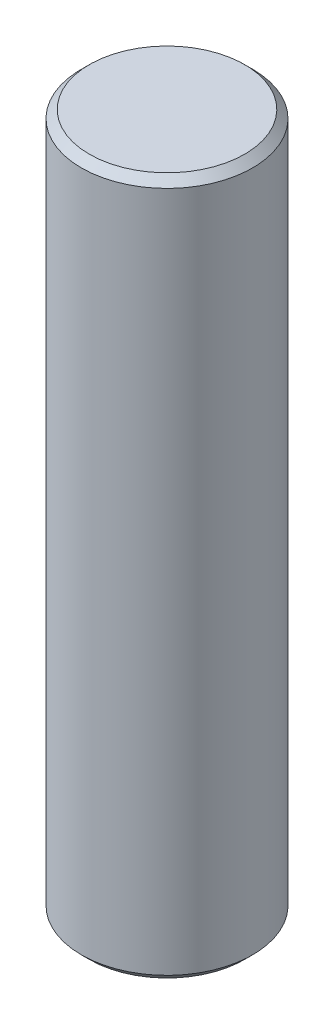
ISO-10303-21;
HEADER;
FILE_DESCRIPTION(('STEP AP214'),'2;1');
FILE_NAME('part.step','',(''),(''),'','','');
FILE_SCHEMA(('AUTOMOTIVE_DESIGN { 1 0 10303 214 1 1 1 1 }'));
ENDSEC;
DATA;
#1=APPLICATION_CONTEXT('core data for automotive mechanical design processes');
#2=APPLICATION_PROTOCOL_DEFINITION('international standard','automotive_design',2000,#1);
#3=PRODUCT_CONTEXT('',#1,'mechanical');
#4=PRODUCT('Part','Part','',(#3));
#5=PRODUCT_RELATED_PRODUCT_CATEGORY('part','',(#4));
#6=PRODUCT_DEFINITION_FORMATION('','',#4);
#7=PRODUCT_DEFINITION_CONTEXT('part definition',#1,'design');
#8=PRODUCT_DEFINITION('design','',#6,#7);
#9=PRODUCT_DEFINITION_SHAPE('','',#8);
#10=(LENGTH_UNIT() NAMED_UNIT(*) SI_UNIT(.MILLI.,.METRE.));
#11=(NAMED_UNIT(*) PLANE_ANGLE_UNIT() SI_UNIT($,.RADIAN.));
#12=(NAMED_UNIT(*) SI_UNIT($,.STERADIAN.) SOLID_ANGLE_UNIT());
#13=UNCERTAINTY_MEASURE_WITH_UNIT(LENGTH_MEASURE(1.E-05),#10,'distance_accuracy_value','');
#14=(GEOMETRIC_REPRESENTATION_CONTEXT(3) GLOBAL_UNCERTAINTY_ASSIGNED_CONTEXT((#13)) GLOBAL_UNIT_ASSIGNED_CONTEXT((#10,
#11,#12)) REPRESENTATION_CONTEXT('',''));
#15=CARTESIAN_POINT('',(0.,0.,0.));
#16=DIRECTION('',(0.,0.,1.));
#17=DIRECTION('',(1.,0.,0.));
#18=AXIS2_PLACEMENT_3D('',#15,#16,#17);
#19=CARTESIAN_POINT('',(0.,22.,0.));
#20=DIRECTION('',(0.,-1.,0.));
#21=DIRECTION('',(0.,0.,-1.));
#22=AXIS2_PLACEMENT_3D('',#19,#20,#21);
#23=CYLINDRICAL_SURFACE('',#22,2.7);
#24=CARTESIAN_POINT('',(0.,0.25,0.));
#25=DIRECTION('',(0.,1.,0.));
#26=DIRECTION('',(0.,0.,1.));
#27=AXIS2_PLACEMENT_3D('',#24,#25,#26);
#28=CIRCLE('',#27,2.7);
#29=CARTESIAN_POINT('',(0.,0.25,2.7));
#30=VERTEX_POINT('',#29);
#31=EDGE_CURVE('E45',#30,#30,#28,.T.);
#32=ORIENTED_EDGE('',*,*,#31,.T.);
#33=EDGE_LOOP('',(#32));
#34=FACE_BOUND('',#33,.T.);
#35=CARTESIAN_POINT('',(0.,21.75,0.));
#36=DIRECTION('',(0.,1.,0.));
#37=DIRECTION('',(0.,0.,1.));
#38=AXIS2_PLACEMENT_3D('',#35,#36,#37);
#39=CIRCLE('',#38,2.7);
#40=CARTESIAN_POINT('',(0.,21.75,2.7));
#41=VERTEX_POINT('',#40);
#42=EDGE_CURVE('E49',#41,#41,#39,.F.);
#43=ORIENTED_EDGE('',*,*,#42,.T.);
#44=EDGE_LOOP('',(#43));
#45=FACE_BOUND('',#44,.T.);
#46=ADVANCED_FACE('F33',(#34,#45),#23,.T.);
#47=CARTESIAN_POINT('',(0.,22.,0.));
#48=DIRECTION('',(0.,1.,0.));
#49=DIRECTION('',(0.,0.,1.));
#50=AXIS2_PLACEMENT_3D('',#47,#48,#49);
#51=PLANE('',#50);
#52=CARTESIAN_POINT('',(0.,22.,0.));
#53=DIRECTION('',(0.,1.,0.));
#54=DIRECTION('',(0.,0.,1.));
#55=AXIS2_PLACEMENT_3D('',#52,#53,#54);
#56=CIRCLE('',#55,2.45);
#57=CARTESIAN_POINT('',(0.,22.,2.45));
#58=VERTEX_POINT('',#57);
#59=EDGE_CURVE('E10',#58,#58,#56,.T.);
#60=ORIENTED_EDGE('',*,*,#59,.T.);
#61=EDGE_LOOP('',(#60));
#62=FACE_BOUND('',#61,.T.);
#63=ADVANCED_FACE('F65',(#62),#51,.T.);
#64=CARTESIAN_POINT('',(0.,0.,0.));
#65=DIRECTION('',(0.,1.,0.));
#66=DIRECTION('',(0.,0.,1.));
#67=AXIS2_PLACEMENT_3D('',#64,#65,#66);
#68=PLANE('',#67);
#69=CARTESIAN_POINT('',(0.,0.,0.));
#70=DIRECTION('',(0.,1.,0.));
#71=DIRECTION('',(0.,0.,1.));
#72=AXIS2_PLACEMENT_3D('',#69,#70,#71);
#73=CIRCLE('',#72,2.45);
#74=CARTESIAN_POINT('',(0.,0.,2.45));
#75=VERTEX_POINT('',#74);
#76=EDGE_CURVE('E41',#75,#75,#73,.F.);
#77=ORIENTED_EDGE('',*,*,#76,.T.);
#78=EDGE_LOOP('',(#77));
#79=FACE_BOUND('',#78,.T.);
#80=ADVANCED_FACE('F62',(#79),#68,.F.);
#81=CARTESIAN_POINT('',(0.,0.25,0.));
#82=DIRECTION('',(0.,1.,0.));
#83=DIRECTION('',(0.,0.,1.));
#84=AXIS2_PLACEMENT_3D('',#81,#82,#83);
#85=CONICAL_SURFACE('',#84,2.7,0.78539816339745);
#86=ORIENTED_EDGE('',*,*,#76,.F.);
#87=EDGE_LOOP('',(#86));
#88=FACE_BOUND('',#87,.T.);
#89=ORIENTED_EDGE('',*,*,#31,.F.);
#90=EDGE_LOOP('',(#89));
#91=FACE_BOUND('',#90,.T.);
#92=ADVANCED_FACE('F58',(#88,#91),#85,.T.);
#93=CARTESIAN_POINT('',(0.,22.,0.));
#94=DIRECTION('',(0.,-1.,0.));
#95=DIRECTION('',(0.,0.,-1.));
#96=AXIS2_PLACEMENT_3D('',#93,#94,#95);
#97=CONICAL_SURFACE('',#96,2.45,0.785398163397454);
#98=ORIENTED_EDGE('',*,*,#42,.F.);
#99=EDGE_LOOP('',(#98));
#100=FACE_BOUND('',#99,.T.);
#101=ORIENTED_EDGE('',*,*,#59,.F.);
#102=EDGE_LOOP('',(#101));
#103=FACE_BOUND('',#102,.T.);
#104=ADVANCED_FACE('F36',(#100,#103),#97,.T.);
#105=CLOSED_SHELL('',(#46,#63,#80,#92,#104));
#106=MANIFOLD_SOLID_BREP('B2',#105);
#107=ADVANCED_BREP_SHAPE_REPRESENTATION('',(#18,#106),#14);
#108=SHAPE_DEFINITION_REPRESENTATION(#9,#107);
ENDSEC;
END-ISO-10303-21;
